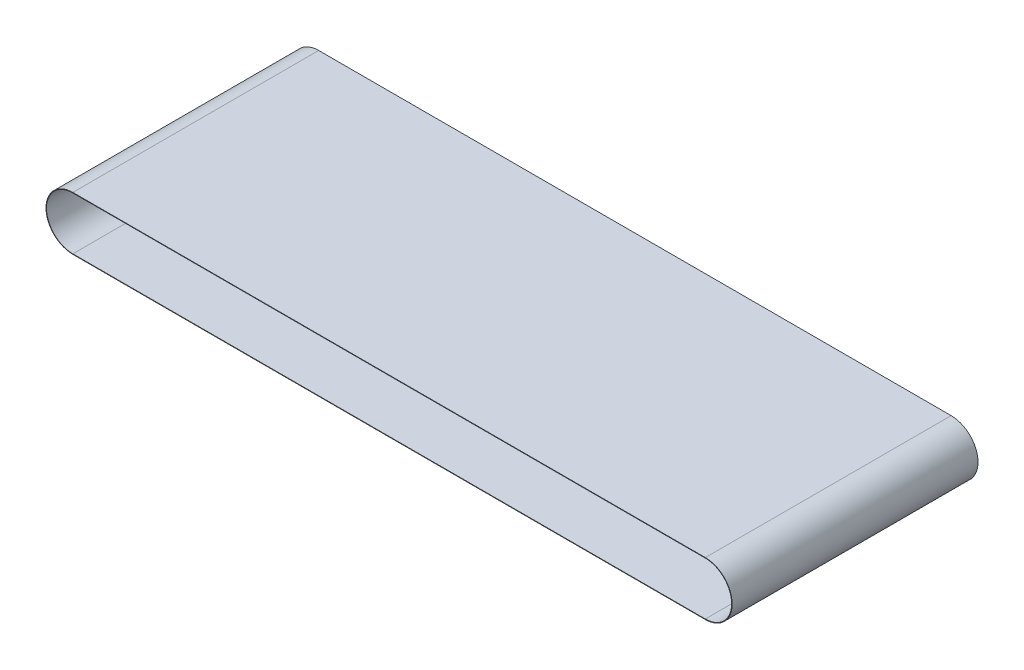
ISO-10303-21;
HEADER;
FILE_DESCRIPTION(('STEP AP214'),'2;1');
FILE_NAME('part.step','',(''),(''),'','','');
FILE_SCHEMA(('AUTOMOTIVE_DESIGN { 1 0 10303 214 1 1 1 1 }'));
ENDSEC;
DATA;
#1=APPLICATION_CONTEXT('core data for automotive mechanical design processes');
#2=APPLICATION_PROTOCOL_DEFINITION('international standard','automotive_design',2000,#1);
#3=PRODUCT_CONTEXT('',#1,'mechanical');
#4=PRODUCT('Part','Part','',(#3));
#5=PRODUCT_RELATED_PRODUCT_CATEGORY('part','',(#4));
#6=PRODUCT_DEFINITION_FORMATION('','',#4);
#7=PRODUCT_DEFINITION_CONTEXT('part definition',#1,'design');
#8=PRODUCT_DEFINITION('design','',#6,#7);
#9=PRODUCT_DEFINITION_SHAPE('','',#8);
#10=(LENGTH_UNIT() NAMED_UNIT(*) SI_UNIT(.MILLI.,.METRE.));
#11=(NAMED_UNIT(*) PLANE_ANGLE_UNIT() SI_UNIT($,.RADIAN.));
#12=(NAMED_UNIT(*) SI_UNIT($,.STERADIAN.) SOLID_ANGLE_UNIT());
#13=UNCERTAINTY_MEASURE_WITH_UNIT(LENGTH_MEASURE(1.E-05),#10,'distance_accuracy_value','');
#14=(GEOMETRIC_REPRESENTATION_CONTEXT(3) GLOBAL_UNCERTAINTY_ASSIGNED_CONTEXT((#13)) GLOBAL_UNIT_ASSIGNED_CONTEXT((#10,
#11,#12)) REPRESENTATION_CONTEXT('',''));
#15=CARTESIAN_POINT('',(0.,0.,0.));
#16=DIRECTION('',(0.,0.,1.));
#17=DIRECTION('',(1.,0.,0.));
#18=AXIS2_PLACEMENT_3D('',#15,#16,#17);
#19=CARTESIAN_POINT('',(3923.27611144198,166.500000000005,762.500000000011));
#20=DIRECTION('',(0.,0.,-1.));
#21=DIRECTION('',(-1.,0.,0.));
#22=AXIS2_PLACEMENT_3D('',#19,#20,#21);
#23=PLANE('',#22);
#24=DIRECTION('',(0.,-1.,0.));
#25=VECTOR('',#24,1.);
#26=CARTESIAN_POINT('',(3923.27611144198,166.500000000005,762.500000000011));
#27=LINE('',#26,#25);
#28=CARTESIAN_POINT('',(3923.27611144198,166.500000000005,762.500000000011));
#29=VERTEX_POINT('',#28);
#30=CARTESIAN_POINT('',(3923.27611144198,163.500000000005,762.500000000011));
#31=VERTEX_POINT('',#30);
#32=EDGE_CURVE('E155',#29,#31,#27,.T.);
#33=ORIENTED_EDGE('',*,*,#32,.F.);
#34=DIRECTION('',(-1.,0.,0.));
#35=VECTOR('',#34,1.);
#36=CARTESIAN_POINT('',(3923.27611144198,166.500000000005,762.500000000011));
#37=LINE('',#36,#35);
#38=CARTESIAN_POINT('',(0.,166.500000000002,762.500000000011));
#39=VERTEX_POINT('',#38);
#40=EDGE_CURVE('E154',#29,#39,#37,.T.);
#41=ORIENTED_EDGE('',*,*,#40,.T.);
#42=DIRECTION('',(0.,-1.,0.));
#43=VECTOR('',#42,1.);
#44=CARTESIAN_POINT('',(0.,166.500000000002,762.500000000011));
#45=LINE('',#44,#43);
#46=CARTESIAN_POINT('',(0.,163.500000000002,762.500000000011));
#47=VERTEX_POINT('',#46);
#48=EDGE_CURVE('E133',#39,#47,#45,.T.);
#49=ORIENTED_EDGE('',*,*,#48,.T.);
#50=DIRECTION('',(-1.,0.,0.));
#51=VECTOR('',#50,1.);
#52=CARTESIAN_POINT('',(3923.27611144198,163.500000000005,762.500000000011));
#53=LINE('',#52,#51);
#54=EDGE_CURVE('E159',#31,#47,#53,.T.);
#55=ORIENTED_EDGE('',*,*,#54,.F.);
#56=EDGE_LOOP('',(#33,#41,#49,#55));
#57=FACE_BOUND('',#56,.T.);
#58=ADVANCED_FACE('F39',(#57),#23,.F.);
#59=CARTESIAN_POINT('',(0.,166.500000000002,762.500000000011));
#60=DIRECTION('',(0.,0.,-1.));
#61=DIRECTION('',(-1.,0.,0.));
#62=AXIS2_PLACEMENT_3D('',#59,#60,#61);
#63=PLANE('',#62);
#64=CARTESIAN_POINT('',(-2.22044604925031E-13,0.,762.500000000011));
#65=DIRECTION('',(0.,0.,1.));
#66=DIRECTION('',(0.,1.,0.));
#67=AXIS2_PLACEMENT_3D('',#64,#65,#66);
#68=CIRCLE('',#67,163.500000000002);
#69=CARTESIAN_POINT('',(0.,-163.500000000002,762.500000000011));
#70=VERTEX_POINT('',#69);
#71=EDGE_CURVE('E123',#47,#70,#68,.T.);
#72=ORIENTED_EDGE('',*,*,#71,.F.);
#73=ORIENTED_EDGE('',*,*,#48,.F.);
#74=CARTESIAN_POINT('',(-2.22044604925031E-13,0.,762.500000000011));
#75=DIRECTION('',(0.,0.,1.));
#76=DIRECTION('',(0.,1.,0.));
#77=AXIS2_PLACEMENT_3D('',#74,#75,#76);
#78=CIRCLE('',#77,166.500000000002);
#79=CARTESIAN_POINT('',(0.,-166.500000000002,762.500000000011));
#80=VERTEX_POINT('',#79);
#81=EDGE_CURVE('E136',#39,#80,#78,.T.);
#82=ORIENTED_EDGE('',*,*,#81,.T.);
#83=DIRECTION('',(0.,1.,0.));
#84=VECTOR('',#83,1.);
#85=CARTESIAN_POINT('',(0.,-166.500000000002,762.500000000011));
#86=LINE('',#85,#84);
#87=EDGE_CURVE('E151',#80,#70,#86,.T.);
#88=ORIENTED_EDGE('',*,*,#87,.T.);
#89=EDGE_LOOP('',(#72,#73,#82,#88));
#90=FACE_BOUND('',#89,.T.);
#91=ADVANCED_FACE('F135',(#90),#63,.F.);
#92=CARTESIAN_POINT('',(-2.22044604925031E-13,0.,0.));
#93=DIRECTION('',(0.,0.,1.));
#94=DIRECTION('',(1.,0.,0.));
#95=AXIS2_PLACEMENT_3D('',#92,#93,#94);
#96=CYLINDRICAL_SURFACE('',#95,163.500000000003);
#97=CARTESIAN_POINT('',(-2.22044604925031E-13,0.,-762.499999999989));
#98=DIRECTION('',(0.,0.,1.));
#99=DIRECTION('',(0.,1.,0.));
#100=AXIS2_PLACEMENT_3D('',#97,#98,#99);
#101=CIRCLE('',#100,163.500000000003);
#102=CARTESIAN_POINT('',(0.,163.500000000003,-762.499999999989));
#103=VERTEX_POINT('',#102);
#104=CARTESIAN_POINT('',(0.,-163.500000000003,-762.499999999989));
#105=VERTEX_POINT('',#104);
#106=EDGE_CURVE('E117',#103,#105,#101,.T.);
#107=ORIENTED_EDGE('',*,*,#106,.F.);
#108=DIRECTION('',(0.,0.,-1.));
#109=VECTOR('',#108,1.);
#110=CARTESIAN_POINT('',(0.,163.500000000002,762.500000000011));
#111=LINE('',#110,#109);
#112=EDGE_CURVE('E141',#47,#103,#111,.T.);
#113=ORIENTED_EDGE('',*,*,#112,.F.);
#114=ORIENTED_EDGE('',*,*,#71,.T.);
#115=DIRECTION('',(0.,0.,-1.));
#116=VECTOR('',#115,1.);
#117=CARTESIAN_POINT('',(0.,-163.500000000002,762.500000000011));
#118=LINE('',#117,#116);
#119=EDGE_CURVE('E199',#70,#105,#118,.T.);
#120=ORIENTED_EDGE('',*,*,#119,.T.);
#121=EDGE_LOOP('',(#107,#113,#114,#120));
#122=FACE_BOUND('',#121,.T.);
#123=ADVANCED_FACE('F218',(#122),#96,.F.);
#124=CARTESIAN_POINT('',(0.,166.500000000003,-762.499999999989));
#125=DIRECTION('',(0.,0.,1.));
#126=DIRECTION('',(1.,0.,0.));
#127=AXIS2_PLACEMENT_3D('',#124,#125,#126);
#128=PLANE('',#127);
#129=CARTESIAN_POINT('',(-2.22044604925031E-13,0.,-762.499999999989));
#130=DIRECTION('',(0.,0.,1.));
#131=DIRECTION('',(0.,1.,0.));
#132=AXIS2_PLACEMENT_3D('',#129,#130,#131);
#133=CIRCLE('',#132,166.500000000003);
#134=CARTESIAN_POINT('',(0.,166.500000000003,-762.499999999989));
#135=VERTEX_POINT('',#134);
#136=CARTESIAN_POINT('',(0.,-166.500000000003,-762.499999999989));
#137=VERTEX_POINT('',#136);
#138=EDGE_CURVE('E169',#135,#137,#133,.T.);
#139=ORIENTED_EDGE('',*,*,#138,.F.);
#140=DIRECTION('',(0.,1.,0.));
#141=VECTOR('',#140,1.);
#142=CARTESIAN_POINT('',(0.,166.500000000003,-762.499999999989));
#143=LINE('',#142,#141);
#144=EDGE_CURVE('E162',#103,#135,#143,.T.);
#145=ORIENTED_EDGE('',*,*,#144,.F.);
#146=ORIENTED_EDGE('',*,*,#106,.T.);
#147=DIRECTION('',(0.,-1.,0.));
#148=VECTOR('',#147,1.);
#149=CARTESIAN_POINT('',(0.,-166.500000000003,-762.499999999989));
#150=LINE('',#149,#148);
#151=EDGE_CURVE('E187',#105,#137,#150,.T.);
#152=ORIENTED_EDGE('',*,*,#151,.T.);
#153=EDGE_LOOP('',(#139,#145,#146,#152));
#154=FACE_BOUND('',#153,.T.);
#155=ADVANCED_FACE('F186',(#154),#128,.F.);
#156=CARTESIAN_POINT('',(-2.22044604925031E-13,0.,0.));
#157=DIRECTION('',(0.,0.,1.));
#158=DIRECTION('',(1.,0.,0.));
#159=AXIS2_PLACEMENT_3D('',#156,#157,#158);
#160=CYLINDRICAL_SURFACE('',#159,166.500000000003);
#161=DIRECTION('',(0.,0.,1.));
#162=VECTOR('',#161,1.);
#163=CARTESIAN_POINT('',(0.,-166.500000000002,762.500000000011));
#164=LINE('',#163,#162);
#165=EDGE_CURVE('E149',#137,#80,#164,.T.);
#166=ORIENTED_EDGE('',*,*,#165,.T.);
#167=ORIENTED_EDGE('',*,*,#81,.F.);
#168=DIRECTION('',(0.,0.,1.));
#169=VECTOR('',#168,1.);
#170=CARTESIAN_POINT('',(0.,166.500000000002,762.500000000011));
#171=LINE('',#170,#169);
#172=EDGE_CURVE('E148',#135,#39,#171,.T.);
#173=ORIENTED_EDGE('',*,*,#172,.F.);
#174=ORIENTED_EDGE('',*,*,#138,.T.);
#175=EDGE_LOOP('',(#166,#167,#173,#174));
#176=FACE_BOUND('',#175,.T.);
#177=ADVANCED_FACE('F146',(#176),#160,.T.);
#178=CARTESIAN_POINT('',(0.,-166.500000000002,762.500000000011));
#179=DIRECTION('',(0.,0.,-1.));
#180=DIRECTION('',(-1.,0.,0.));
#181=AXIS2_PLACEMENT_3D('',#178,#179,#180);
#182=PLANE('',#181);
#183=DIRECTION('',(1.,0.,0.));
#184=VECTOR('',#183,1.);
#185=CARTESIAN_POINT('',(0.,-163.500000000002,762.500000000011));
#186=LINE('',#185,#184);
#187=CARTESIAN_POINT('',(3923.27611144198,-163.5,762.500000000011));
#188=VERTEX_POINT('',#187);
#189=EDGE_CURVE('E104',#70,#188,#186,.T.);
#190=ORIENTED_EDGE('',*,*,#189,.F.);
#191=ORIENTED_EDGE('',*,*,#87,.F.);
#192=DIRECTION('',(1.,0.,0.));
#193=VECTOR('',#192,1.);
#194=CARTESIAN_POINT('',(0.,-166.500000000002,762.500000000011));
#195=LINE('',#194,#193);
#196=CARTESIAN_POINT('',(3923.27611144198,-166.5,762.500000000011));
#197=VERTEX_POINT('',#196);
#198=EDGE_CURVE('E168',#80,#197,#195,.T.);
#199=ORIENTED_EDGE('',*,*,#198,.T.);
#200=DIRECTION('',(0.,1.,0.));
#201=VECTOR('',#200,1.);
#202=CARTESIAN_POINT('',(3923.27611144198,-166.5,762.500000000011));
#203=LINE('',#202,#201);
#204=EDGE_CURVE('E209',#197,#188,#203,.T.);
#205=ORIENTED_EDGE('',*,*,#204,.T.);
#206=EDGE_LOOP('',(#190,#191,#199,#205));
#207=FACE_BOUND('',#206,.T.);
#208=ADVANCED_FACE('F214',(#207),#182,.F.);
#209=CARTESIAN_POINT('',(0.,-163.500000000002,762.500000000011));
#210=DIRECTION('',(0.,-1.,0.));
#211=DIRECTION('',(1.,0.,0.));
#212=AXIS2_PLACEMENT_3D('',#209,#210,#211);
#213=PLANE('',#212);
#214=DIRECTION('',(1.,0.,0.));
#215=VECTOR('',#214,1.);
#216=CARTESIAN_POINT('',(0.,-163.500000000003,-762.499999999989));
#217=LINE('',#216,#215);
#218=CARTESIAN_POINT('',(3923.27611144198,-163.5,-762.499999999989));
#219=VERTEX_POINT('',#218);
#220=EDGE_CURVE('E97',#105,#219,#217,.T.);
#221=ORIENTED_EDGE('',*,*,#220,.F.);
#222=ORIENTED_EDGE('',*,*,#119,.F.);
#223=ORIENTED_EDGE('',*,*,#189,.T.);
#224=DIRECTION('',(0.,0.,-1.));
#225=VECTOR('',#224,1.);
#226=CARTESIAN_POINT('',(3923.27611144198,-163.5,762.500000000011));
#227=LINE('',#226,#225);
#228=EDGE_CURVE('E196',#188,#219,#227,.T.);
#229=ORIENTED_EDGE('',*,*,#228,.T.);
#230=EDGE_LOOP('',(#221,#222,#223,#229));
#231=FACE_BOUND('',#230,.T.);
#232=ADVANCED_FACE('F217',(#231),#213,.F.);
#233=CARTESIAN_POINT('',(0.,-166.500000000003,-762.499999999989));
#234=DIRECTION('',(0.,0.,1.));
#235=DIRECTION('',(1.,0.,0.));
#236=AXIS2_PLACEMENT_3D('',#233,#234,#235);
#237=PLANE('',#236);
#238=DIRECTION('',(1.,0.,0.));
#239=VECTOR('',#238,1.);
#240=CARTESIAN_POINT('',(0.,-166.500000000003,-762.499999999989));
#241=LINE('',#240,#239);
#242=CARTESIAN_POINT('',(3923.27611144198,-166.5,-762.499999999989));
#243=VERTEX_POINT('',#242);
#244=EDGE_CURVE('E88',#137,#243,#241,.T.);
#245=ORIENTED_EDGE('',*,*,#244,.F.);
#246=ORIENTED_EDGE('',*,*,#151,.F.);
#247=ORIENTED_EDGE('',*,*,#220,.T.);
#248=DIRECTION('',(0.,-1.,0.));
#249=VECTOR('',#248,1.);
#250=CARTESIAN_POINT('',(3923.27611144198,-166.5,-762.499999999989));
#251=LINE('',#250,#249);
#252=EDGE_CURVE('E174',#219,#243,#251,.T.);
#253=ORIENTED_EDGE('',*,*,#252,.T.);
#254=EDGE_LOOP('',(#245,#246,#247,#253));
#255=FACE_BOUND('',#254,.T.);
#256=ADVANCED_FACE('F236',(#255),#237,.F.);
#257=CARTESIAN_POINT('',(0.,-166.500000000002,762.500000000011));
#258=DIRECTION('',(0.,1.,0.));
#259=DIRECTION('',(-1.,0.,0.));
#260=AXIS2_PLACEMENT_3D('',#257,#258,#259);
#261=PLANE('',#260);
#262=DIRECTION('',(0.,0.,1.));
#263=VECTOR('',#262,1.);
#264=CARTESIAN_POINT('',(3923.27611144198,-166.5,762.500000000011));
#265=LINE('',#264,#263);
#266=EDGE_CURVE('E170',#243,#197,#265,.T.);
#267=ORIENTED_EDGE('',*,*,#266,.T.);
#268=ORIENTED_EDGE('',*,*,#198,.F.);
#269=ORIENTED_EDGE('',*,*,#165,.F.);
#270=ORIENTED_EDGE('',*,*,#244,.T.);
#271=EDGE_LOOP('',(#267,#268,#269,#270));
#272=FACE_BOUND('',#271,.T.);
#273=ADVANCED_FACE('F228',(#272),#261,.F.);
#274=CARTESIAN_POINT('',(3923.27611144198,-166.5,762.500000000011));
#275=DIRECTION('',(0.,0.,-1.));
#276=DIRECTION('',(-1.,0.,0.));
#277=AXIS2_PLACEMENT_3D('',#274,#275,#276);
#278=PLANE('',#277);
#279=CARTESIAN_POINT('',(3923.27611144198,2.66453525910038E-12,762.500000000011));
#280=DIRECTION('',(0.,0.,1.));
#281=DIRECTION('',(0.,-1.,0.));
#282=AXIS2_PLACEMENT_3D('',#279,#280,#281);
#283=CIRCLE('',#282,163.500000000002);
#284=EDGE_CURVE('E194',#188,#31,#283,.T.);
#285=ORIENTED_EDGE('',*,*,#284,.F.);
#286=ORIENTED_EDGE('',*,*,#204,.F.);
#287=CARTESIAN_POINT('',(3923.27611144198,2.66453525910038E-12,762.500000000011));
#288=DIRECTION('',(0.,0.,1.));
#289=DIRECTION('',(0.,-1.,0.));
#290=AXIS2_PLACEMENT_3D('',#287,#288,#289);
#291=CIRCLE('',#290,166.500000000002);
#292=EDGE_CURVE('E171',#197,#29,#291,.T.);
#293=ORIENTED_EDGE('',*,*,#292,.T.);
#294=ORIENTED_EDGE('',*,*,#32,.T.);
#295=EDGE_LOOP('',(#285,#286,#293,#294));
#296=FACE_BOUND('',#295,.T.);
#297=ADVANCED_FACE('F226',(#296),#278,.F.);
#298=CARTESIAN_POINT('',(3923.27611144198,2.66453525910038E-12,0.));
#299=DIRECTION('',(0.,0.,1.));
#300=DIRECTION('',(1.,0.,0.));
#301=AXIS2_PLACEMENT_3D('',#298,#299,#300);
#302=CYLINDRICAL_SURFACE('',#301,163.500000000003);
#303=CARTESIAN_POINT('',(3923.27611144198,2.66453525910038E-12,-762.499999999989));
#304=DIRECTION('',(0.,0.,1.));
#305=DIRECTION('',(0.,-1.,0.));
#306=AXIS2_PLACEMENT_3D('',#303,#304,#305);
#307=CIRCLE('',#306,163.500000000003);
#308=CARTESIAN_POINT('',(3923.27611144198,163.500000000006,-762.499999999989));
#309=VERTEX_POINT('',#308);
#310=EDGE_CURVE('E64',#219,#309,#307,.T.);
#311=ORIENTED_EDGE('',*,*,#310,.F.);
#312=ORIENTED_EDGE('',*,*,#228,.F.);
#313=ORIENTED_EDGE('',*,*,#284,.T.);
#314=DIRECTION('',(0.,0.,-1.));
#315=VECTOR('',#314,1.);
#316=CARTESIAN_POINT('',(3923.27611144198,163.500000000005,762.500000000011));
#317=LINE('',#316,#315);
#318=EDGE_CURVE('E192',#31,#309,#317,.T.);
#319=ORIENTED_EDGE('',*,*,#318,.T.);
#320=EDGE_LOOP('',(#311,#312,#313,#319));
#321=FACE_BOUND('',#320,.T.);
#322=ADVANCED_FACE('F223',(#321),#302,.F.);
#323=CARTESIAN_POINT('',(3923.27611144198,-166.5,-762.499999999989));
#324=DIRECTION('',(0.,0.,1.));
#325=DIRECTION('',(1.,0.,0.));
#326=AXIS2_PLACEMENT_3D('',#323,#324,#325);
#327=PLANE('',#326);
#328=CARTESIAN_POINT('',(3923.27611144198,2.66453525910038E-12,-762.499999999989));
#329=DIRECTION('',(0.,0.,1.));
#330=DIRECTION('',(0.,-1.,0.));
#331=AXIS2_PLACEMENT_3D('',#328,#329,#330);
#332=CIRCLE('',#331,166.500000000003);
#333=CARTESIAN_POINT('',(3923.27611144198,166.500000000006,-762.499999999989));
#334=VERTEX_POINT('',#333);
#335=EDGE_CURVE('E56',#243,#334,#332,.T.);
#336=ORIENTED_EDGE('',*,*,#335,.F.);
#337=ORIENTED_EDGE('',*,*,#252,.F.);
#338=ORIENTED_EDGE('',*,*,#310,.T.);
#339=DIRECTION('',(0.,1.,0.));
#340=VECTOR('',#339,1.);
#341=CARTESIAN_POINT('',(3923.27611144198,166.500000000006,-762.499999999989));
#342=LINE('',#341,#340);
#343=EDGE_CURVE('E179',#309,#334,#342,.T.);
#344=ORIENTED_EDGE('',*,*,#343,.T.);
#345=EDGE_LOOP('',(#336,#337,#338,#344));
#346=FACE_BOUND('',#345,.T.);
#347=ADVANCED_FACE('F234',(#346),#327,.F.);
#348=CARTESIAN_POINT('',(3923.27611144198,2.66453525910038E-12,0.));
#349=DIRECTION('',(0.,0.,1.));
#350=DIRECTION('',(1.,0.,0.));
#351=AXIS2_PLACEMENT_3D('',#348,#349,#350);
#352=CYLINDRICAL_SURFACE('',#351,166.500000000003);
#353=DIRECTION('',(0.,0.,1.));
#354=VECTOR('',#353,1.);
#355=CARTESIAN_POINT('',(3923.27611144198,166.500000000005,762.500000000011));
#356=LINE('',#355,#354);
#357=EDGE_CURVE('E43',#334,#29,#356,.T.);
#358=ORIENTED_EDGE('',*,*,#357,.T.);
#359=ORIENTED_EDGE('',*,*,#292,.F.);
#360=ORIENTED_EDGE('',*,*,#266,.F.);
#361=ORIENTED_EDGE('',*,*,#335,.T.);
#362=EDGE_LOOP('',(#358,#359,#360,#361));
#363=FACE_BOUND('',#362,.T.);
#364=ADVANCED_FACE('F180',(#363),#352,.T.);
#365=CARTESIAN_POINT('',(3923.27611144198,163.500000000005,762.500000000011));
#366=DIRECTION('',(0.,1.,0.));
#367=DIRECTION('',(-1.,0.,0.));
#368=AXIS2_PLACEMENT_3D('',#365,#366,#367);
#369=PLANE('',#368);
#370=ORIENTED_EDGE('',*,*,#54,.T.);
#371=ORIENTED_EDGE('',*,*,#112,.T.);
#372=DIRECTION('',(-1.,0.,0.));
#373=VECTOR('',#372,1.);
#374=CARTESIAN_POINT('',(3923.27611144198,163.500000000006,-762.499999999989));
#375=LINE('',#374,#373);
#376=EDGE_CURVE('E48',#309,#103,#375,.T.);
#377=ORIENTED_EDGE('',*,*,#376,.F.);
#378=ORIENTED_EDGE('',*,*,#318,.F.);
#379=EDGE_LOOP('',(#370,#371,#377,#378));
#380=FACE_BOUND('',#379,.T.);
#381=ADVANCED_FACE('F220',(#380),#369,.F.);
#382=CARTESIAN_POINT('',(3923.27611144198,166.500000000006,-762.499999999989));
#383=DIRECTION('',(0.,0.,1.));
#384=DIRECTION('',(1.,0.,0.));
#385=AXIS2_PLACEMENT_3D('',#382,#383,#384);
#386=PLANE('',#385);
#387=ORIENTED_EDGE('',*,*,#376,.T.);
#388=ORIENTED_EDGE('',*,*,#144,.T.);
#389=DIRECTION('',(-1.,0.,0.));
#390=VECTOR('',#389,1.);
#391=CARTESIAN_POINT('',(3923.27611144198,166.500000000006,-762.499999999989));
#392=LINE('',#391,#390);
#393=EDGE_CURVE('E11',#334,#135,#392,.T.);
#394=ORIENTED_EDGE('',*,*,#393,.F.);
#395=ORIENTED_EDGE('',*,*,#343,.F.);
#396=EDGE_LOOP('',(#387,#388,#394,#395));
#397=FACE_BOUND('',#396,.T.);
#398=ADVANCED_FACE('F184',(#397),#386,.F.);
#399=CARTESIAN_POINT('',(3923.27611144198,166.500000000005,762.500000000011));
#400=DIRECTION('',(0.,-1.,0.));
#401=DIRECTION('',(1.,0.,0.));
#402=AXIS2_PLACEMENT_3D('',#399,#400,#401);
#403=PLANE('',#402);
#404=ORIENTED_EDGE('',*,*,#393,.T.);
#405=ORIENTED_EDGE('',*,*,#172,.T.);
#406=ORIENTED_EDGE('',*,*,#40,.F.);
#407=ORIENTED_EDGE('',*,*,#357,.F.);
#408=EDGE_LOOP('',(#404,#405,#406,#407));
#409=FACE_BOUND('',#408,.T.);
#410=ADVANCED_FACE('F41',(#409),#403,.F.);
#411=CLOSED_SHELL('',(#58,#91,#123,#155,#177,#208,#232,#256,#273,#297,#322,#347,#364,#381,#398,#410));
#412=MANIFOLD_SOLID_BREP('B2',#411);
#413=ADVANCED_BREP_SHAPE_REPRESENTATION('',(#18,#412),#14);
#414=SHAPE_DEFINITION_REPRESENTATION(#9,#413);
ENDSEC;
END-ISO-10303-21;
